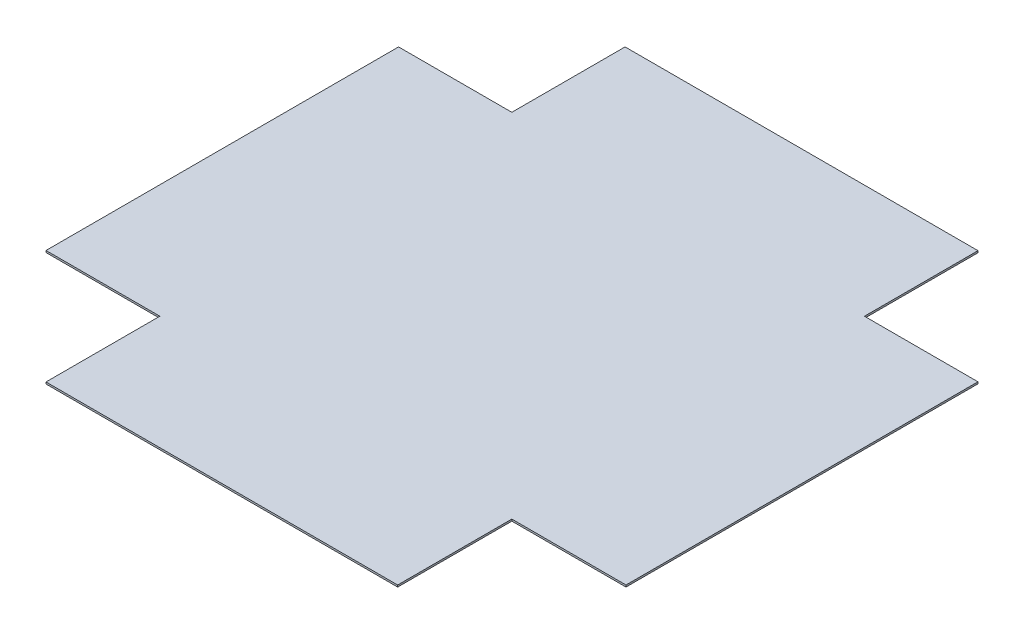
ISO-10303-21;
HEADER;
FILE_DESCRIPTION(('STEP AP214'),'2;1');
FILE_NAME('part.step','',(''),(''),'','','');
FILE_SCHEMA(('AUTOMOTIVE_DESIGN { 1 0 10303 214 1 1 1 1 }'));
ENDSEC;
DATA;
#1=APPLICATION_CONTEXT('core data for automotive mechanical design processes');
#2=APPLICATION_PROTOCOL_DEFINITION('international standard','automotive_design',2000,#1);
#3=PRODUCT_CONTEXT('',#1,'mechanical');
#4=PRODUCT('Part','Part','',(#3));
#5=PRODUCT_RELATED_PRODUCT_CATEGORY('part','',(#4));
#6=PRODUCT_DEFINITION_FORMATION('','',#4);
#7=PRODUCT_DEFINITION_CONTEXT('part definition',#1,'design');
#8=PRODUCT_DEFINITION('design','',#6,#7);
#9=PRODUCT_DEFINITION_SHAPE('','',#8);
#10=(LENGTH_UNIT() NAMED_UNIT(*) SI_UNIT(.MILLI.,.METRE.));
#11=(NAMED_UNIT(*) PLANE_ANGLE_UNIT() SI_UNIT($,.RADIAN.));
#12=(NAMED_UNIT(*) SI_UNIT($,.STERADIAN.) SOLID_ANGLE_UNIT());
#13=UNCERTAINTY_MEASURE_WITH_UNIT(LENGTH_MEASURE(1.E-05),#10,'distance_accuracy_value','');
#14=(GEOMETRIC_REPRESENTATION_CONTEXT(3) GLOBAL_UNCERTAINTY_ASSIGNED_CONTEXT((#13)) GLOBAL_UNIT_ASSIGNED_CONTEXT((#10,
#11,#12)) REPRESENTATION_CONTEXT('',''));
#15=CARTESIAN_POINT('',(0.,0.,0.));
#16=DIRECTION('',(0.,0.,1.));
#17=DIRECTION('',(1.,0.,0.));
#18=AXIS2_PLACEMENT_3D('',#15,#16,#17);
#19=CARTESIAN_POINT('',(-355.6,2.25276224610044,-355.6));
#20=DIRECTION('',(1.,0.,0.));
#21=DIRECTION('',(0.,0.,-1.));
#22=AXIS2_PLACEMENT_3D('',#19,#20,#21);
#23=PLANE('',#22);
#24=DIRECTION('',(0.,0.,1.));
#25=VECTOR('',#24,1.);
#26=CARTESIAN_POINT('',(-355.6,2.25276224610044,-355.6));
#27=LINE('',#26,#25);
#28=CARTESIAN_POINT('',(-355.6,2.25276224610044,-216.658411149582));
#29=VERTEX_POINT('',#28);
#30=CARTESIAN_POINT('',(-355.6,2.25276224610044,215.899975754325));
#31=VERTEX_POINT('',#30);
#32=EDGE_CURVE('E148',#29,#31,#27,.T.);
#33=ORIENTED_EDGE('',*,*,#32,.F.);
#34=DIRECTION('',(0.,1.,0.));
#35=VECTOR('',#34,1.);
#36=CARTESIAN_POINT('',(-355.6,-64.9853222864381,-216.658411149582));
#37=LINE('',#36,#35);
#38=CARTESIAN_POINT('',(-355.6,0.,-216.658411149582));
#39=VERTEX_POINT('',#38);
#40=EDGE_CURVE('E191',#39,#29,#37,.T.);
#41=ORIENTED_EDGE('',*,*,#40,.F.);
#42=DIRECTION('',(0.,0.,1.));
#43=VECTOR('',#42,1.);
#44=CARTESIAN_POINT('',(-355.6,0.,-355.6));
#45=LINE('',#44,#43);
#46=CARTESIAN_POINT('',(-355.6,0.,215.899975754325));
#47=VERTEX_POINT('',#46);
#48=EDGE_CURVE('E166',#39,#47,#45,.T.);
#49=ORIENTED_EDGE('',*,*,#48,.T.);
#50=DIRECTION('',(0.,-1.,0.));
#51=VECTOR('',#50,1.);
#52=CARTESIAN_POINT('',(-355.6,67.2380845325385,215.899975754325));
#53=LINE('',#52,#51);
#54=EDGE_CURVE('E170',#31,#47,#53,.T.);
#55=ORIENTED_EDGE('',*,*,#54,.F.);
#56=EDGE_LOOP('',(#33,#41,#49,#55));
#57=FACE_BOUND('',#56,.T.);
#58=ADVANCED_FACE('F39',(#57),#23,.F.);
#59=CARTESIAN_POINT('',(355.6,2.25276224610044,-355.6));
#60=DIRECTION('',(-1.,0.,0.));
#61=DIRECTION('',(0.,0.,1.));
#62=AXIS2_PLACEMENT_3D('',#59,#60,#61);
#63=PLANE('',#62);
#64=DIRECTION('',(0.,0.,-1.));
#65=VECTOR('',#64,1.);
#66=CARTESIAN_POINT('',(355.6,0.,-355.6));
#67=LINE('',#66,#65);
#68=CARTESIAN_POINT('',(355.6,0.,215.519477502658));
#69=VERTEX_POINT('',#68);
#70=CARTESIAN_POINT('',(355.6,0.,-216.26320263449));
#71=VERTEX_POINT('',#70);
#72=EDGE_CURVE('E160',#69,#71,#67,.T.);
#73=ORIENTED_EDGE('',*,*,#72,.T.);
#74=DIRECTION('',(0.,1.,0.));
#75=VECTOR('',#74,1.);
#76=CARTESIAN_POINT('',(355.6,-64.9853222864381,-216.26320263449));
#77=LINE('',#76,#75);
#78=CARTESIAN_POINT('',(355.6,2.25276224610044,-216.26320263449));
#79=VERTEX_POINT('',#78);
#80=EDGE_CURVE('E242',#71,#79,#77,.T.);
#81=ORIENTED_EDGE('',*,*,#80,.T.);
#82=DIRECTION('',(0.,0.,-1.));
#83=VECTOR('',#82,1.);
#84=CARTESIAN_POINT('',(355.6,2.25276224610044,-355.6));
#85=LINE('',#84,#83);
#86=CARTESIAN_POINT('',(355.6,2.25276224610044,215.519477502658));
#87=VERTEX_POINT('',#86);
#88=EDGE_CURVE('E149',#87,#79,#85,.T.);
#89=ORIENTED_EDGE('',*,*,#88,.F.);
#90=DIRECTION('',(0.,1.,0.));
#91=VECTOR('',#90,1.);
#92=CARTESIAN_POINT('',(355.6,-64.9853222864381,215.519477502658));
#93=LINE('',#92,#91);
#94=EDGE_CURVE('E203',#69,#87,#93,.T.);
#95=ORIENTED_EDGE('',*,*,#94,.F.);
#96=EDGE_LOOP('',(#73,#81,#89,#95));
#97=FACE_BOUND('',#96,.T.);
#98=ADVANCED_FACE('F41',(#97),#63,.F.);
#99=CARTESIAN_POINT('',(-355.6,2.25276224610044,-355.6));
#100=DIRECTION('',(0.,0.,1.));
#101=DIRECTION('',(1.,0.,0.));
#102=AXIS2_PLACEMENT_3D('',#99,#100,#101);
#103=PLANE('',#102);
#104=DIRECTION('',(-1.,0.,0.));
#105=VECTOR('',#104,1.);
#106=CARTESIAN_POINT('',(-355.6,2.25276224610044,-355.6));
#107=LINE('',#106,#105);
#108=CARTESIAN_POINT('',(216.328543179686,2.25276224610044,-355.6));
#109=VERTEX_POINT('',#108);
#110=CARTESIAN_POINT('',(-216.658411149582,2.25276224610044,-355.6));
#111=VERTEX_POINT('',#110);
#112=EDGE_CURVE('E140',#109,#111,#107,.T.);
#113=ORIENTED_EDGE('',*,*,#112,.F.);
#114=DIRECTION('',(0.,1.,0.));
#115=VECTOR('',#114,1.);
#116=CARTESIAN_POINT('',(216.328543179686,-64.9853222864381,-355.6));
#117=LINE('',#116,#115);
#118=CARTESIAN_POINT('',(216.328543179686,0.,-355.6));
#119=VERTEX_POINT('',#118);
#120=EDGE_CURVE('E126',#119,#109,#117,.T.);
#121=ORIENTED_EDGE('',*,*,#120,.F.);
#122=DIRECTION('',(-1.,0.,0.));
#123=VECTOR('',#122,1.);
#124=CARTESIAN_POINT('',(-355.6,0.,-355.6));
#125=LINE('',#124,#123);
#126=CARTESIAN_POINT('',(-216.658411149582,0.,-355.6));
#127=VERTEX_POINT('',#126);
#128=EDGE_CURVE('E163',#119,#127,#125,.T.);
#129=ORIENTED_EDGE('',*,*,#128,.T.);
#130=DIRECTION('',(0.,1.,0.));
#131=VECTOR('',#130,1.);
#132=CARTESIAN_POINT('',(-216.658411149582,-64.9853222864381,-355.6));
#133=LINE('',#132,#131);
#134=EDGE_CURVE('E147',#127,#111,#133,.T.);
#135=ORIENTED_EDGE('',*,*,#134,.T.);
#136=EDGE_LOOP('',(#113,#121,#129,#135));
#137=FACE_BOUND('',#136,.T.);
#138=ADVANCED_FACE('F145',(#137),#103,.F.);
#139=CARTESIAN_POINT('',(-355.6,2.25276224610044,355.6));
#140=DIRECTION('',(0.,0.,-1.));
#141=DIRECTION('',(-1.,0.,0.));
#142=AXIS2_PLACEMENT_3D('',#139,#140,#141);
#143=PLANE('',#142);
#144=DIRECTION('',(1.,0.,0.));
#145=VECTOR('',#144,1.);
#146=CARTESIAN_POINT('',(-355.6,0.,355.6));
#147=LINE('',#146,#145);
#148=CARTESIAN_POINT('',(-215.899987893198,0.,355.599997570012));
#149=VERTEX_POINT('',#148);
#150=CARTESIAN_POINT('',(215.545696419123,0.,355.6));
#151=VERTEX_POINT('',#150);
#152=EDGE_CURVE('E153',#149,#151,#147,.T.);
#153=ORIENTED_EDGE('',*,*,#152,.T.);
#154=DIRECTION('',(0.,1.,0.));
#155=VECTOR('',#154,1.);
#156=CARTESIAN_POINT('',(215.545696419123,-64.9853222864381,355.6));
#157=LINE('',#156,#155);
#158=CARTESIAN_POINT('',(215.545696419123,2.25276224610044,355.6));
#159=VERTEX_POINT('',#158);
#160=EDGE_CURVE('E204',#151,#159,#157,.T.);
#161=ORIENTED_EDGE('',*,*,#160,.T.);
#162=DIRECTION('',(1.,0.,0.));
#163=VECTOR('',#162,1.);
#164=CARTESIAN_POINT('',(-355.6,2.25276224610044,355.6));
#165=LINE('',#164,#163);
#166=CARTESIAN_POINT('',(-215.899987893198,2.25276224610044,355.599997570012));
#167=VERTEX_POINT('',#166);
#168=EDGE_CURVE('E151',#167,#159,#165,.T.);
#169=ORIENTED_EDGE('',*,*,#168,.F.);
#170=DIRECTION('',(0.,-1.,0.));
#171=VECTOR('',#170,1.);
#172=CARTESIAN_POINT('',(-215.899987893198,67.2380845325385,355.599997570012));
#173=LINE('',#172,#171);
#174=EDGE_CURVE('E174',#167,#149,#173,.T.);
#175=ORIENTED_EDGE('',*,*,#174,.T.);
#176=EDGE_LOOP('',(#153,#161,#169,#175));
#177=FACE_BOUND('',#176,.T.);
#178=ADVANCED_FACE('F234',(#177),#143,.F.);
#179=CARTESIAN_POINT('',(0.,2.25276224610044,0.));
#180=DIRECTION('',(0.,1.,0.));
#181=DIRECTION('',(0.,0.,1.));
#182=AXIS2_PLACEMENT_3D('',#179,#180,#181);
#183=PLANE('',#182);
#184=DIRECTION('',(1.,0.,0.));
#185=VECTOR('',#184,1.);
#186=CARTESIAN_POINT('',(216.328543179687,2.25276224610044,-216.26320263449));
#187=LINE('',#186,#185);
#188=CARTESIAN_POINT('',(216.328543179687,2.25276224610044,-216.26320263449));
#189=VERTEX_POINT('',#188);
#190=EDGE_CURVE('E135',#189,#79,#187,.T.);
#191=ORIENTED_EDGE('',*,*,#190,.F.);
#192=DIRECTION('',(0.,0.,1.));
#193=VECTOR('',#192,1.);
#194=CARTESIAN_POINT('',(216.328543179686,2.25276224610044,-355.6));
#195=LINE('',#194,#193);
#196=EDGE_CURVE('E129',#109,#189,#195,.T.);
#197=ORIENTED_EDGE('',*,*,#196,.F.);
#198=ORIENTED_EDGE('',*,*,#112,.T.);
#199=DIRECTION('',(0.,0.,-1.));
#200=VECTOR('',#199,1.);
#201=CARTESIAN_POINT('',(-216.658411149582,2.25276224610044,-355.6));
#202=LINE('',#201,#200);
#203=CARTESIAN_POINT('',(-216.658411149582,2.25276224610044,-216.658411149582));
#204=VERTEX_POINT('',#203);
#205=EDGE_CURVE('E190',#204,#111,#202,.T.);
#206=ORIENTED_EDGE('',*,*,#205,.F.);
#207=DIRECTION('',(1.,0.,0.));
#208=VECTOR('',#207,1.);
#209=CARTESIAN_POINT('',(-355.6,2.25276224610044,-216.658411149582));
#210=LINE('',#209,#208);
#211=EDGE_CURVE('E192',#29,#204,#210,.T.);
#212=ORIENTED_EDGE('',*,*,#211,.F.);
#213=ORIENTED_EDGE('',*,*,#32,.T.);
#214=DIRECTION('',(-1.,0.,0.));
#215=VECTOR('',#214,1.);
#216=CARTESIAN_POINT('',(0.,2.25276224610044,215.899975754325));
#217=LINE('',#216,#215);
#218=CARTESIAN_POINT('',(-215.899987893198,2.25276224610044,215.899975754325));
#219=VERTEX_POINT('',#218);
#220=EDGE_CURVE('E214',#219,#31,#217,.T.);
#221=ORIENTED_EDGE('',*,*,#220,.F.);
#222=DIRECTION('',(0.,0.,-1.));
#223=VECTOR('',#222,1.);
#224=CARTESIAN_POINT('',(-215.899987893198,2.25276224610044,0.));
#225=LINE('',#224,#223);
#226=EDGE_CURVE('E164',#167,#219,#225,.T.);
#227=ORIENTED_EDGE('',*,*,#226,.F.);
#228=ORIENTED_EDGE('',*,*,#168,.T.);
#229=DIRECTION('',(0.,0.,1.));
#230=VECTOR('',#229,1.);
#231=CARTESIAN_POINT('',(215.545696419123,2.25276224610044,215.519477502658));
#232=LINE('',#231,#230);
#233=CARTESIAN_POINT('',(215.545696419123,2.25276224610044,215.519477502658));
#234=VERTEX_POINT('',#233);
#235=EDGE_CURVE('E201',#234,#159,#232,.T.);
#236=ORIENTED_EDGE('',*,*,#235,.F.);
#237=DIRECTION('',(-1.,0.,0.));
#238=VECTOR('',#237,1.);
#239=CARTESIAN_POINT('',(215.545696419123,2.25276224610044,215.519477502658));
#240=LINE('',#239,#238);
#241=EDGE_CURVE('E198',#87,#234,#240,.T.);
#242=ORIENTED_EDGE('',*,*,#241,.F.);
#243=ORIENTED_EDGE('',*,*,#88,.T.);
#244=EDGE_LOOP('',(#191,#197,#198,#206,#212,#213,#221,#227,#228,#236,#242,#243));
#245=FACE_BOUND('',#244,.T.);
#246=ADVANCED_FACE('F138',(#245),#183,.T.);
#247=CARTESIAN_POINT('',(0.,0.,0.));
#248=DIRECTION('',(0.,1.,0.));
#249=DIRECTION('',(0.,0.,1.));
#250=AXIS2_PLACEMENT_3D('',#247,#248,#249);
#251=PLANE('',#250);
#252=DIRECTION('',(0.,0.,1.));
#253=VECTOR('',#252,1.);
#254=CARTESIAN_POINT('',(216.328543179687,0.,0.));
#255=LINE('',#254,#253);
#256=CARTESIAN_POINT('',(216.328543179687,0.,-216.26320263449));
#257=VERTEX_POINT('',#256);
#258=EDGE_CURVE('E47',#119,#257,#255,.T.);
#259=ORIENTED_EDGE('',*,*,#258,.T.);
#260=DIRECTION('',(1.,0.,0.));
#261=VECTOR('',#260,1.);
#262=CARTESIAN_POINT('',(0.,0.,-216.26320263449));
#263=LINE('',#262,#261);
#264=EDGE_CURVE('E11',#257,#71,#263,.T.);
#265=ORIENTED_EDGE('',*,*,#264,.T.);
#266=ORIENTED_EDGE('',*,*,#72,.F.);
#267=DIRECTION('',(-1.,0.,0.));
#268=VECTOR('',#267,1.);
#269=CARTESIAN_POINT('',(0.,0.,215.519477502658));
#270=LINE('',#269,#268);
#271=CARTESIAN_POINT('',(215.545696419123,0.,215.519477502658));
#272=VERTEX_POINT('',#271);
#273=EDGE_CURVE('E159',#69,#272,#270,.T.);
#274=ORIENTED_EDGE('',*,*,#273,.T.);
#275=DIRECTION('',(0.,0.,1.));
#276=VECTOR('',#275,1.);
#277=CARTESIAN_POINT('',(215.545696419123,0.,0.));
#278=LINE('',#277,#276);
#279=EDGE_CURVE('E177',#272,#151,#278,.T.);
#280=ORIENTED_EDGE('',*,*,#279,.T.);
#281=ORIENTED_EDGE('',*,*,#152,.F.);
#282=DIRECTION('',(0.,0.,1.));
#283=VECTOR('',#282,1.);
#284=CARTESIAN_POINT('',(-215.899987893198,0.,355.599997570012));
#285=LINE('',#284,#283);
#286=CARTESIAN_POINT('',(-215.899987893198,0.,215.899975754325));
#287=VERTEX_POINT('',#286);
#288=EDGE_CURVE('E207',#287,#149,#285,.T.);
#289=ORIENTED_EDGE('',*,*,#288,.F.);
#290=DIRECTION('',(1.,0.,0.));
#291=VECTOR('',#290,1.);
#292=CARTESIAN_POINT('',(-355.600009708884,0.,215.899975754325));
#293=LINE('',#292,#291);
#294=EDGE_CURVE('E212',#47,#287,#293,.T.);
#295=ORIENTED_EDGE('',*,*,#294,.F.);
#296=ORIENTED_EDGE('',*,*,#48,.F.);
#297=DIRECTION('',(1.,0.,0.));
#298=VECTOR('',#297,1.);
#299=CARTESIAN_POINT('',(0.,0.,-216.658411149582));
#300=LINE('',#299,#298);
#301=CARTESIAN_POINT('',(-216.658411149582,0.,-216.658411149582));
#302=VERTEX_POINT('',#301);
#303=EDGE_CURVE('E180',#39,#302,#300,.T.);
#304=ORIENTED_EDGE('',*,*,#303,.T.);
#305=DIRECTION('',(0.,0.,-1.));
#306=VECTOR('',#305,1.);
#307=CARTESIAN_POINT('',(-216.658411149582,0.,0.));
#308=LINE('',#307,#306);
#309=EDGE_CURVE('E183',#302,#127,#308,.T.);
#310=ORIENTED_EDGE('',*,*,#309,.T.);
#311=ORIENTED_EDGE('',*,*,#128,.F.);
#312=EDGE_LOOP('',(#259,#265,#266,#274,#280,#281,#289,#295,#296,#304,#310,#311));
#313=FACE_BOUND('',#312,.T.);
#314=ADVANCED_FACE('F186',(#313),#251,.F.);
#315=CARTESIAN_POINT('',(-215.899987893198,67.2380845325385,355.599997570012));
#316=DIRECTION('',(1.,0.,0.));
#317=DIRECTION('',(0.,0.,-1.));
#318=AXIS2_PLACEMENT_3D('',#315,#316,#317);
#319=PLANE('',#318);
#320=ORIENTED_EDGE('',*,*,#226,.T.);
#321=DIRECTION('',(0.,-1.,0.));
#322=VECTOR('',#321,1.);
#323=CARTESIAN_POINT('',(-215.899987893198,67.2380845325385,215.899975754325));
#324=LINE('',#323,#322);
#325=EDGE_CURVE('E173',#219,#287,#324,.T.);
#326=ORIENTED_EDGE('',*,*,#325,.T.);
#327=ORIENTED_EDGE('',*,*,#288,.T.);
#328=ORIENTED_EDGE('',*,*,#174,.F.);
#329=EDGE_LOOP('',(#320,#326,#327,#328));
#330=FACE_BOUND('',#329,.T.);
#331=ADVANCED_FACE('F230',(#330),#319,.F.);
#332=CARTESIAN_POINT('',(-355.600009708884,67.2380845325385,215.899975754325));
#333=DIRECTION('',(0.,0.,-1.));
#334=DIRECTION('',(-1.,0.,0.));
#335=AXIS2_PLACEMENT_3D('',#332,#333,#334);
#336=PLANE('',#335);
#337=ORIENTED_EDGE('',*,*,#220,.T.);
#338=ORIENTED_EDGE('',*,*,#54,.T.);
#339=ORIENTED_EDGE('',*,*,#294,.T.);
#340=ORIENTED_EDGE('',*,*,#325,.F.);
#341=EDGE_LOOP('',(#337,#338,#339,#340));
#342=FACE_BOUND('',#341,.T.);
#343=ADVANCED_FACE('F224',(#342),#336,.F.);
#344=CARTESIAN_POINT('',(215.545696419123,-64.9853222864381,215.519477502658));
#345=DIRECTION('',(-1.,0.,0.));
#346=DIRECTION('',(0.,0.,1.));
#347=AXIS2_PLACEMENT_3D('',#344,#345,#346);
#348=PLANE('',#347);
#349=DIRECTION('',(0.,1.,0.));
#350=VECTOR('',#349,1.);
#351=CARTESIAN_POINT('',(215.545696419123,-64.9853222864381,215.519477502658));
#352=LINE('',#351,#350);
#353=EDGE_CURVE('E208',#272,#234,#352,.T.);
#354=ORIENTED_EDGE('',*,*,#353,.T.);
#355=ORIENTED_EDGE('',*,*,#235,.T.);
#356=ORIENTED_EDGE('',*,*,#160,.F.);
#357=ORIENTED_EDGE('',*,*,#279,.F.);
#358=EDGE_LOOP('',(#354,#355,#356,#357));
#359=FACE_BOUND('',#358,.T.);
#360=ADVANCED_FACE('F257',(#359),#348,.F.);
#361=CARTESIAN_POINT('',(215.545696419123,-64.9853222864381,215.519477502658));
#362=DIRECTION('',(0.,0.,-1.));
#363=DIRECTION('',(-1.,0.,0.));
#364=AXIS2_PLACEMENT_3D('',#361,#362,#363);
#365=PLANE('',#364);
#366=ORIENTED_EDGE('',*,*,#94,.T.);
#367=ORIENTED_EDGE('',*,*,#241,.T.);
#368=ORIENTED_EDGE('',*,*,#353,.F.);
#369=ORIENTED_EDGE('',*,*,#273,.F.);
#370=EDGE_LOOP('',(#366,#367,#368,#369));
#371=FACE_BOUND('',#370,.T.);
#372=ADVANCED_FACE('F254',(#371),#365,.F.);
#373=CARTESIAN_POINT('',(-216.658411149582,-64.9853222864381,-355.6));
#374=DIRECTION('',(1.,0.,0.));
#375=DIRECTION('',(0.,0.,-1.));
#376=AXIS2_PLACEMENT_3D('',#373,#374,#375);
#377=PLANE('',#376);
#378=DIRECTION('',(0.,1.,0.));
#379=VECTOR('',#378,1.);
#380=CARTESIAN_POINT('',(-216.658411149582,-64.9853222864381,-216.658411149582));
#381=LINE('',#380,#379);
#382=EDGE_CURVE('E62',#302,#204,#381,.T.);
#383=ORIENTED_EDGE('',*,*,#382,.T.);
#384=ORIENTED_EDGE('',*,*,#205,.T.);
#385=ORIENTED_EDGE('',*,*,#134,.F.);
#386=ORIENTED_EDGE('',*,*,#309,.F.);
#387=EDGE_LOOP('',(#383,#384,#385,#386));
#388=FACE_BOUND('',#387,.T.);
#389=ADVANCED_FACE('F189',(#388),#377,.F.);
#390=CARTESIAN_POINT('',(-355.6,-64.9853222864381,-216.658411149582));
#391=DIRECTION('',(0.,0.,1.));
#392=DIRECTION('',(1.,0.,0.));
#393=AXIS2_PLACEMENT_3D('',#390,#391,#392);
#394=PLANE('',#393);
#395=ORIENTED_EDGE('',*,*,#40,.T.);
#396=ORIENTED_EDGE('',*,*,#211,.T.);
#397=ORIENTED_EDGE('',*,*,#382,.F.);
#398=ORIENTED_EDGE('',*,*,#303,.F.);
#399=EDGE_LOOP('',(#395,#396,#397,#398));
#400=FACE_BOUND('',#399,.T.);
#401=ADVANCED_FACE('F241',(#400),#394,.F.);
#402=CARTESIAN_POINT('',(216.328543179687,-64.9853222864381,-216.26320263449));
#403=DIRECTION('',(0.,0.,1.));
#404=DIRECTION('',(1.,0.,0.));
#405=AXIS2_PLACEMENT_3D('',#402,#403,#404);
#406=PLANE('',#405);
#407=DIRECTION('',(0.,1.,0.));
#408=VECTOR('',#407,1.);
#409=CARTESIAN_POINT('',(216.328543179687,-64.9853222864381,-216.26320263449));
#410=LINE('',#409,#408);
#411=EDGE_CURVE('E54',#257,#189,#410,.T.);
#412=ORIENTED_EDGE('',*,*,#411,.T.);
#413=ORIENTED_EDGE('',*,*,#190,.T.);
#414=ORIENTED_EDGE('',*,*,#80,.F.);
#415=ORIENTED_EDGE('',*,*,#264,.F.);
#416=EDGE_LOOP('',(#412,#413,#414,#415));
#417=FACE_BOUND('',#416,.T.);
#418=ADVANCED_FACE('F249',(#417),#406,.F.);
#419=CARTESIAN_POINT('',(216.328543179686,-64.9853222864381,-355.6));
#420=DIRECTION('',(-1.,0.,0.));
#421=DIRECTION('',(0.,0.,1.));
#422=AXIS2_PLACEMENT_3D('',#419,#420,#421);
#423=PLANE('',#422);
#424=ORIENTED_EDGE('',*,*,#120,.T.);
#425=ORIENTED_EDGE('',*,*,#196,.T.);
#426=ORIENTED_EDGE('',*,*,#411,.F.);
#427=ORIENTED_EDGE('',*,*,#258,.F.);
#428=EDGE_LOOP('',(#424,#425,#426,#427));
#429=FACE_BOUND('',#428,.T.);
#430=ADVANCED_FACE('F128',(#429),#423,.F.);
#431=CLOSED_SHELL('',(#58,#98,#138,#178,#246,#314,#331,#343,#360,#372,#389,#401,#418,#430));
#432=MANIFOLD_SOLID_BREP('B2',#431);
#433=ADVANCED_BREP_SHAPE_REPRESENTATION('',(#18,#432),#14);
#434=SHAPE_DEFINITION_REPRESENTATION(#9,#433);
ENDSEC;
END-ISO-10303-21;
